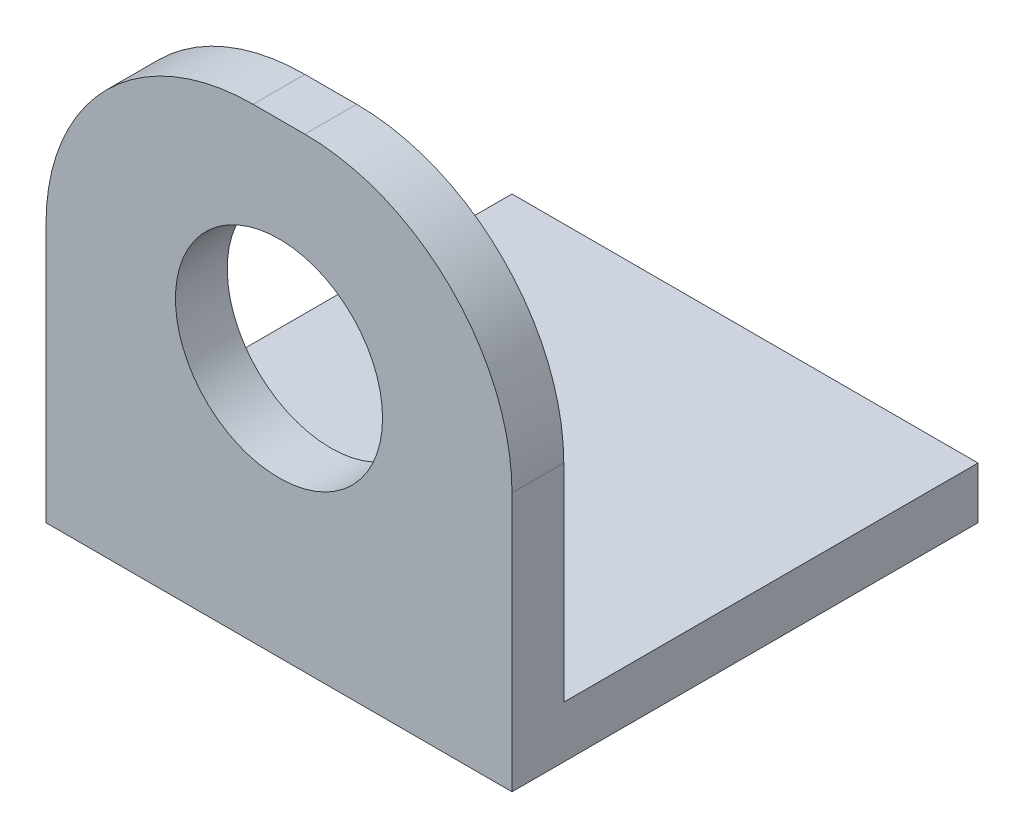
ISO-10303-21;
HEADER;
FILE_DESCRIPTION(('STEP AP214'),'2;1');
FILE_NAME('part.step','',(''),(''),'','','');
FILE_SCHEMA(('AUTOMOTIVE_DESIGN { 1 0 10303 214 1 1 1 1 }'));
ENDSEC;
DATA;
#1=APPLICATION_CONTEXT('core data for automotive mechanical design processes');
#2=APPLICATION_PROTOCOL_DEFINITION('international standard','automotive_design',2000,#1);
#3=PRODUCT_CONTEXT('',#1,'mechanical');
#4=PRODUCT('Part','Part','',(#3));
#5=PRODUCT_RELATED_PRODUCT_CATEGORY('part','',(#4));
#6=PRODUCT_DEFINITION_FORMATION('','',#4);
#7=PRODUCT_DEFINITION_CONTEXT('part definition',#1,'design');
#8=PRODUCT_DEFINITION('design','',#6,#7);
#9=PRODUCT_DEFINITION_SHAPE('','',#8);
#10=(LENGTH_UNIT() NAMED_UNIT(*) SI_UNIT(.MILLI.,.METRE.));
#11=(NAMED_UNIT(*) PLANE_ANGLE_UNIT() SI_UNIT($,.RADIAN.));
#12=(NAMED_UNIT(*) SI_UNIT($,.STERADIAN.) SOLID_ANGLE_UNIT());
#13=UNCERTAINTY_MEASURE_WITH_UNIT(LENGTH_MEASURE(1.E-05),#10,'distance_accuracy_value','');
#14=(GEOMETRIC_REPRESENTATION_CONTEXT(3) GLOBAL_UNCERTAINTY_ASSIGNED_CONTEXT((#13)) GLOBAL_UNIT_ASSIGNED_CONTEXT((#10,
#11,#12)) REPRESENTATION_CONTEXT('',''));
#15=CARTESIAN_POINT('',(0.,0.,0.));
#16=DIRECTION('',(0.,0.,1.));
#17=DIRECTION('',(1.,0.,0.));
#18=AXIS2_PLACEMENT_3D('',#15,#16,#17);
#19=CARTESIAN_POINT('',(9.,-1.,1.));
#20=DIRECTION('',(0.,1.,0.));
#21=DIRECTION('',(0.,0.,1.));
#22=AXIS2_PLACEMENT_3D('',#19,#20,#21);
#23=PLANE('',#22);
#24=DIRECTION('',(0.,0.,-1.));
#25=VECTOR('',#24,1.);
#26=CARTESIAN_POINT('',(0.,-1.,1.));
#27=LINE('',#26,#25);
#28=CARTESIAN_POINT('',(0.,-1.,1.));
#29=VERTEX_POINT('',#28);
#30=CARTESIAN_POINT('',(0.,-1.,-8.));
#31=VERTEX_POINT('',#30);
#32=EDGE_CURVE('E125',#29,#31,#27,.T.);
#33=ORIENTED_EDGE('',*,*,#32,.T.);
#34=DIRECTION('',(-1.,0.,0.));
#35=VECTOR('',#34,1.);
#36=CARTESIAN_POINT('',(9.,-1.,-8.));
#37=LINE('',#36,#35);
#38=CARTESIAN_POINT('',(9.,-1.,-8.));
#39=VERTEX_POINT('',#38);
#40=EDGE_CURVE('E106',#39,#31,#37,.T.);
#41=ORIENTED_EDGE('',*,*,#40,.F.);
#42=DIRECTION('',(0.,0.,-1.));
#43=VECTOR('',#42,1.);
#44=CARTESIAN_POINT('',(9.,-1.,1.));
#45=LINE('',#44,#43);
#46=CARTESIAN_POINT('',(9.,-1.,1.));
#47=VERTEX_POINT('',#46);
#48=EDGE_CURVE('E113',#47,#39,#45,.T.);
#49=ORIENTED_EDGE('',*,*,#48,.F.);
#50=DIRECTION('',(-1.,0.,0.));
#51=VECTOR('',#50,1.);
#52=CARTESIAN_POINT('',(9.,-1.,1.));
#53=LINE('',#52,#51);
#54=EDGE_CURVE('E165',#47,#29,#53,.T.);
#55=ORIENTED_EDGE('',*,*,#54,.T.);
#56=EDGE_LOOP('',(#33,#41,#49,#55));
#57=FACE_BOUND('',#56,.T.);
#58=ADVANCED_FACE('F33',(#57),#23,.F.);
#59=CARTESIAN_POINT('',(9.,-1.,-8.));
#60=DIRECTION('',(0.,0.,1.));
#61=DIRECTION('',(0.,-1.,0.));
#62=AXIS2_PLACEMENT_3D('',#59,#60,#61);
#63=PLANE('',#62);
#64=DIRECTION('',(0.,1.,0.));
#65=VECTOR('',#64,1.);
#66=CARTESIAN_POINT('',(0.,-1.,-8.));
#67=LINE('',#66,#65);
#68=CARTESIAN_POINT('',(0.,0.,-8.));
#69=VERTEX_POINT('',#68);
#70=EDGE_CURVE('E171',#31,#69,#67,.T.);
#71=ORIENTED_EDGE('',*,*,#70,.T.);
#72=DIRECTION('',(-1.,0.,0.));
#73=VECTOR('',#72,1.);
#74=CARTESIAN_POINT('',(9.,0.,-8.));
#75=LINE('',#74,#73);
#76=CARTESIAN_POINT('',(9.,0.,-8.));
#77=VERTEX_POINT('',#76);
#78=EDGE_CURVE('E109',#77,#69,#75,.T.);
#79=ORIENTED_EDGE('',*,*,#78,.F.);
#80=DIRECTION('',(0.,1.,0.));
#81=VECTOR('',#80,1.);
#82=CARTESIAN_POINT('',(9.,-1.,-8.));
#83=LINE('',#82,#81);
#84=EDGE_CURVE('E102',#39,#77,#83,.T.);
#85=ORIENTED_EDGE('',*,*,#84,.F.);
#86=ORIENTED_EDGE('',*,*,#40,.T.);
#87=EDGE_LOOP('',(#71,#79,#85,#86));
#88=FACE_BOUND('',#87,.T.);
#89=ADVANCED_FACE('F104',(#88),#63,.F.);
#90=CARTESIAN_POINT('',(9.,0.,-8.));
#91=DIRECTION('',(0.,-1.,0.));
#92=DIRECTION('',(0.,0.,-1.));
#93=AXIS2_PLACEMENT_3D('',#90,#91,#92);
#94=PLANE('',#93);
#95=DIRECTION('',(0.,0.,1.));
#96=VECTOR('',#95,1.);
#97=CARTESIAN_POINT('',(0.,0.,-8.));
#98=LINE('',#97,#96);
#99=CARTESIAN_POINT('',(0.,0.,0.));
#100=VERTEX_POINT('',#99);
#101=EDGE_CURVE('E161',#69,#100,#98,.T.);
#102=ORIENTED_EDGE('',*,*,#101,.T.);
#103=DIRECTION('',(-1.,0.,0.));
#104=VECTOR('',#103,1.);
#105=CARTESIAN_POINT('',(9.,0.,0.));
#106=LINE('',#105,#104);
#107=CARTESIAN_POINT('',(9.,0.,0.));
#108=VERTEX_POINT('',#107);
#109=EDGE_CURVE('E130',#108,#100,#106,.T.);
#110=ORIENTED_EDGE('',*,*,#109,.F.);
#111=DIRECTION('',(0.,0.,1.));
#112=VECTOR('',#111,1.);
#113=CARTESIAN_POINT('',(9.,0.,-8.));
#114=LINE('',#113,#112);
#115=EDGE_CURVE('E112',#77,#108,#114,.T.);
#116=ORIENTED_EDGE('',*,*,#115,.F.);
#117=ORIENTED_EDGE('',*,*,#78,.T.);
#118=EDGE_LOOP('',(#102,#110,#116,#117));
#119=FACE_BOUND('',#118,.T.);
#120=ADVANCED_FACE('F202',(#119),#94,.F.);
#121=CARTESIAN_POINT('',(9.,0.,0.));
#122=DIRECTION('',(0.,0.,1.));
#123=DIRECTION('',(0.,-1.,0.));
#124=AXIS2_PLACEMENT_3D('',#121,#122,#123);
#125=PLANE('',#124);
#126=CARTESIAN_POINT('',(4.5,4.,0.));
#127=DIRECTION('',(0.,0.,1.));
#128=DIRECTION('',(0.,-1.,0.));
#129=AXIS2_PLACEMENT_3D('',#126,#127,#128);
#130=CIRCLE('',#129,2.);
#131=CARTESIAN_POINT('',(4.5,2.,0.));
#132=VERTEX_POINT('',#131);
#133=EDGE_CURVE('E175',#132,#132,#130,.T.);
#134=ORIENTED_EDGE('',*,*,#133,.T.);
#135=EDGE_LOOP('',(#134));
#136=FACE_BOUND('',#135,.T.);
#137=DIRECTION('',(0.,1.,0.));
#138=VECTOR('',#137,1.);
#139=CARTESIAN_POINT('',(0.,0.,0.));
#140=LINE('',#139,#138);
#141=CARTESIAN_POINT('',(0.,4.,0.));
#142=VERTEX_POINT('',#141);
#143=EDGE_CURVE('E146',#100,#142,#140,.T.);
#144=ORIENTED_EDGE('',*,*,#143,.T.);
#145=CARTESIAN_POINT('',(4.,4.,0.));
#146=DIRECTION('',(0.,0.,1.));
#147=DIRECTION('',(0.,-1.,0.));
#148=AXIS2_PLACEMENT_3D('',#145,#146,#147);
#149=CIRCLE('',#148,4.);
#150=CARTESIAN_POINT('',(4.,8.,0.));
#151=VERTEX_POINT('',#150);
#152=EDGE_CURVE('E41',#142,#151,#149,.F.);
#153=ORIENTED_EDGE('',*,*,#152,.T.);
#154=DIRECTION('',(-1.,0.,0.));
#155=VECTOR('',#154,1.);
#156=CARTESIAN_POINT('',(9.,8.,0.));
#157=LINE('',#156,#155);
#158=CARTESIAN_POINT('',(5.,8.,0.));
#159=VERTEX_POINT('',#158);
#160=EDGE_CURVE('E144',#159,#151,#157,.T.);
#161=ORIENTED_EDGE('',*,*,#160,.F.);
#162=CARTESIAN_POINT('',(5.,4.,0.));
#163=DIRECTION('',(0.,0.,1.));
#164=DIRECTION('',(0.,-1.,0.));
#165=AXIS2_PLACEMENT_3D('',#162,#163,#164);
#166=CIRCLE('',#165,4.);
#167=CARTESIAN_POINT('',(9.,4.,0.));
#168=VERTEX_POINT('',#167);
#169=EDGE_CURVE('E48',#159,#168,#166,.F.);
#170=ORIENTED_EDGE('',*,*,#169,.T.);
#171=DIRECTION('',(0.,1.,0.));
#172=VECTOR('',#171,1.);
#173=CARTESIAN_POINT('',(9.,0.,0.));
#174=LINE('',#173,#172);
#175=EDGE_CURVE('E168',#108,#168,#174,.T.);
#176=ORIENTED_EDGE('',*,*,#175,.F.);
#177=ORIENTED_EDGE('',*,*,#109,.T.);
#178=EDGE_LOOP('',(#144,#153,#161,#170,#176,#177));
#179=FACE_BOUND('',#178,.T.);
#180=ADVANCED_FACE('F143',(#136,#179),#125,.F.);
#181=CARTESIAN_POINT('',(9.,8.,0.));
#182=DIRECTION('',(0.,-1.,0.));
#183=DIRECTION('',(0.,0.,-1.));
#184=AXIS2_PLACEMENT_3D('',#181,#182,#183);
#185=PLANE('',#184);
#186=ORIENTED_EDGE('',*,*,#160,.T.);
#187=DIRECTION('',(0.,0.,1.));
#188=VECTOR('',#187,1.);
#189=CARTESIAN_POINT('',(4.,8.,0.));
#190=LINE('',#189,#188);
#191=CARTESIAN_POINT('',(4.,8.,1.));
#192=VERTEX_POINT('',#191);
#193=EDGE_CURVE('E128',#151,#192,#190,.T.);
#194=ORIENTED_EDGE('',*,*,#193,.T.);
#195=DIRECTION('',(-1.,0.,0.));
#196=VECTOR('',#195,1.);
#197=CARTESIAN_POINT('',(9.,8.,1.));
#198=LINE('',#197,#196);
#199=CARTESIAN_POINT('',(5.,8.,1.));
#200=VERTEX_POINT('',#199);
#201=EDGE_CURVE('E154',#200,#192,#198,.T.);
#202=ORIENTED_EDGE('',*,*,#201,.F.);
#203=DIRECTION('',(0.,0.,1.));
#204=VECTOR('',#203,1.);
#205=CARTESIAN_POINT('',(5.,8.,0.));
#206=LINE('',#205,#204);
#207=EDGE_CURVE('E126',#200,#159,#206,.F.);
#208=ORIENTED_EDGE('',*,*,#207,.T.);
#209=EDGE_LOOP('',(#186,#194,#202,#208));
#210=FACE_BOUND('',#209,.T.);
#211=ADVANCED_FACE('F150',(#210),#185,.F.);
#212=CARTESIAN_POINT('',(9.,8.,1.));
#213=DIRECTION('',(0.,0.,-1.));
#214=DIRECTION('',(0.,1.,0.));
#215=AXIS2_PLACEMENT_3D('',#212,#213,#214);
#216=PLANE('',#215);
#217=CARTESIAN_POINT('',(4.5,4.,1.));
#218=DIRECTION('',(0.,0.,1.));
#219=DIRECTION('',(1.,0.,0.));
#220=AXIS2_PLACEMENT_3D('',#217,#218,#219);
#221=CIRCLE('',#220,2.);
#222=CARTESIAN_POINT('',(6.5,4.,1.));
#223=VERTEX_POINT('',#222);
#224=EDGE_CURVE('E181',#223,#223,#221,.T.);
#225=ORIENTED_EDGE('',*,*,#224,.F.);
#226=EDGE_LOOP('',(#225));
#227=FACE_BOUND('',#226,.T.);
#228=ORIENTED_EDGE('',*,*,#201,.T.);
#229=CARTESIAN_POINT('',(4.,4.,1.));
#230=DIRECTION('',(0.,0.,-1.));
#231=DIRECTION('',(0.,1.,0.));
#232=AXIS2_PLACEMENT_3D('',#229,#230,#231);
#233=CIRCLE('',#232,4.);
#234=CARTESIAN_POINT('',(0.,4.,1.));
#235=VERTEX_POINT('',#234);
#236=EDGE_CURVE('E138',#192,#235,#233,.F.);
#237=ORIENTED_EDGE('',*,*,#236,.T.);
#238=DIRECTION('',(0.,-1.,0.));
#239=VECTOR('',#238,1.);
#240=CARTESIAN_POINT('',(0.,8.,1.));
#241=LINE('',#240,#239);
#242=EDGE_CURVE('E122',#235,#29,#241,.T.);
#243=ORIENTED_EDGE('',*,*,#242,.T.);
#244=ORIENTED_EDGE('',*,*,#54,.F.);
#245=DIRECTION('',(0.,-1.,0.));
#246=VECTOR('',#245,1.);
#247=CARTESIAN_POINT('',(9.,8.,1.));
#248=LINE('',#247,#246);
#249=CARTESIAN_POINT('',(9.,4.,1.));
#250=VERTEX_POINT('',#249);
#251=EDGE_CURVE('E118',#250,#47,#248,.T.);
#252=ORIENTED_EDGE('',*,*,#251,.F.);
#253=CARTESIAN_POINT('',(5.,4.,1.));
#254=DIRECTION('',(0.,0.,-1.));
#255=DIRECTION('',(0.,1.,0.));
#256=AXIS2_PLACEMENT_3D('',#253,#254,#255);
#257=CIRCLE('',#256,4.);
#258=EDGE_CURVE('E136',#250,#200,#257,.F.);
#259=ORIENTED_EDGE('',*,*,#258,.T.);
#260=EDGE_LOOP('',(#228,#237,#243,#244,#252,#259));
#261=FACE_BOUND('',#260,.T.);
#262=ADVANCED_FACE('F158',(#227,#261),#216,.F.);
#263=CARTESIAN_POINT('',(9.,0.,0.));
#264=DIRECTION('',(1.,0.,0.));
#265=DIRECTION('',(0.,0.,-1.));
#266=AXIS2_PLACEMENT_3D('',#263,#264,#265);
#267=PLANE('',#266);
#268=ORIENTED_EDGE('',*,*,#175,.T.);
#269=DIRECTION('',(0.,0.,1.));
#270=VECTOR('',#269,1.);
#271=CARTESIAN_POINT('',(9.,4.,1.));
#272=LINE('',#271,#270);
#273=EDGE_CURVE('E11',#168,#250,#272,.T.);
#274=ORIENTED_EDGE('',*,*,#273,.T.);
#275=ORIENTED_EDGE('',*,*,#251,.T.);
#276=ORIENTED_EDGE('',*,*,#48,.T.);
#277=ORIENTED_EDGE('',*,*,#84,.T.);
#278=ORIENTED_EDGE('',*,*,#115,.T.);
#279=EDGE_LOOP('',(#268,#274,#275,#276,#277,#278));
#280=FACE_BOUND('',#279,.T.);
#281=ADVANCED_FACE('F116',(#280),#267,.T.);
#282=CARTESIAN_POINT('',(0.,0.,0.));
#283=DIRECTION('',(1.,0.,0.));
#284=DIRECTION('',(0.,0.,-1.));
#285=AXIS2_PLACEMENT_3D('',#282,#283,#284);
#286=PLANE('',#285);
#287=ORIENTED_EDGE('',*,*,#242,.F.);
#288=DIRECTION('',(0.,0.,1.));
#289=VECTOR('',#288,1.);
#290=CARTESIAN_POINT('',(0.,4.,0.));
#291=LINE('',#290,#289);
#292=EDGE_CURVE('E56',#235,#142,#291,.F.);
#293=ORIENTED_EDGE('',*,*,#292,.T.);
#294=ORIENTED_EDGE('',*,*,#143,.F.);
#295=ORIENTED_EDGE('',*,*,#101,.F.);
#296=ORIENTED_EDGE('',*,*,#70,.F.);
#297=ORIENTED_EDGE('',*,*,#32,.F.);
#298=EDGE_LOOP('',(#287,#293,#294,#295,#296,#297));
#299=FACE_BOUND('',#298,.T.);
#300=ADVANCED_FACE('F159',(#299),#286,.F.);
#301=CARTESIAN_POINT('',(4.5,4.,-9.));
#302=DIRECTION('',(0.,0.,1.));
#303=DIRECTION('',(1.,0.,0.));
#304=AXIS2_PLACEMENT_3D('',#301,#302,#303);
#305=CYLINDRICAL_SURFACE('',#304,2.);
#306=ORIENTED_EDGE('',*,*,#224,.T.);
#307=EDGE_LOOP('',(#306));
#308=FACE_BOUND('',#307,.T.);
#309=ORIENTED_EDGE('',*,*,#133,.F.);
#310=EDGE_LOOP('',(#309));
#311=FACE_BOUND('',#310,.T.);
#312=ADVANCED_FACE('F185',(#308,#311),#305,.F.);
#313=CARTESIAN_POINT('',(4.,4.,0.));
#314=DIRECTION('',(0.,0.,1.));
#315=DIRECTION('',(1.,0.,0.));
#316=AXIS2_PLACEMENT_3D('',#313,#314,#315);
#317=CYLINDRICAL_SURFACE('',#316,4.);
#318=ORIENTED_EDGE('',*,*,#152,.F.);
#319=ORIENTED_EDGE('',*,*,#292,.F.);
#320=ORIENTED_EDGE('',*,*,#236,.F.);
#321=ORIENTED_EDGE('',*,*,#193,.F.);
#322=EDGE_LOOP('',(#318,#319,#320,#321));
#323=FACE_BOUND('',#322,.T.);
#324=ADVANCED_FACE('F156',(#323),#317,.T.);
#325=CARTESIAN_POINT('',(5.,4.,0.));
#326=DIRECTION('',(0.,0.,-1.));
#327=DIRECTION('',(-1.,0.,0.));
#328=AXIS2_PLACEMENT_3D('',#325,#326,#327);
#329=CYLINDRICAL_SURFACE('',#328,4.);
#330=ORIENTED_EDGE('',*,*,#169,.F.);
#331=ORIENTED_EDGE('',*,*,#207,.F.);
#332=ORIENTED_EDGE('',*,*,#258,.F.);
#333=ORIENTED_EDGE('',*,*,#273,.F.);
#334=EDGE_LOOP('',(#330,#331,#332,#333));
#335=FACE_BOUND('',#334,.T.);
#336=ADVANCED_FACE('F35',(#335),#329,.T.);
#337=CLOSED_SHELL('',(#58,#89,#120,#180,#211,#262,#281,#300,#312,#324,#336));
#338=MANIFOLD_SOLID_BREP('B2',#337);
#339=ADVANCED_BREP_SHAPE_REPRESENTATION('',(#18,#338),#14);
#340=SHAPE_DEFINITION_REPRESENTATION(#9,#339);
ENDSEC;
END-ISO-10303-21;
